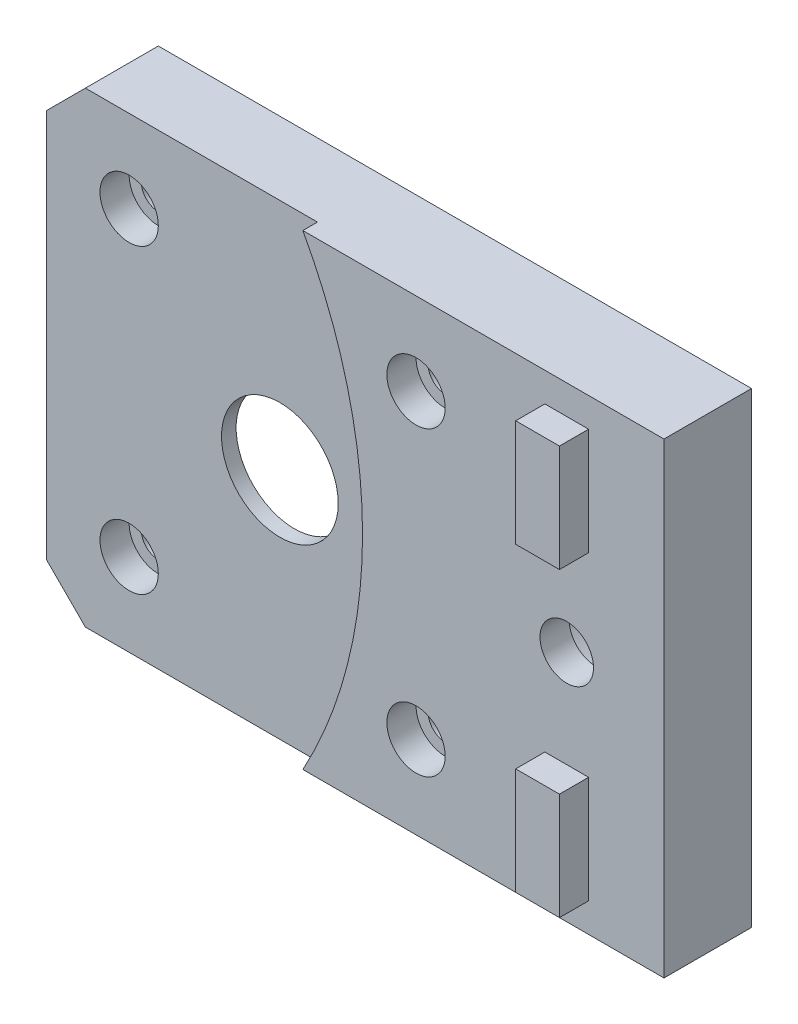
ISO-10303-21;
HEADER;
FILE_DESCRIPTION(('STEP AP214'),'2;1');
FILE_NAME('part.step','',(''),(''),'','','');
FILE_SCHEMA(('AUTOMOTIVE_DESIGN { 1 0 10303 214 1 1 1 1 }'));
ENDSEC;
DATA;
#1=APPLICATION_CONTEXT('core data for automotive mechanical design processes');
#2=APPLICATION_PROTOCOL_DEFINITION('international standard','automotive_design',2000,#1);
#3=PRODUCT_CONTEXT('',#1,'mechanical');
#4=PRODUCT('Part','Part','',(#3));
#5=PRODUCT_RELATED_PRODUCT_CATEGORY('part','',(#4));
#6=PRODUCT_DEFINITION_FORMATION('','',#4);
#7=PRODUCT_DEFINITION_CONTEXT('part definition',#1,'design');
#8=PRODUCT_DEFINITION('design','',#6,#7);
#9=PRODUCT_DEFINITION_SHAPE('','',#8);
#10=(LENGTH_UNIT() NAMED_UNIT(*) SI_UNIT(.MILLI.,.METRE.));
#11=(NAMED_UNIT(*) PLANE_ANGLE_UNIT() SI_UNIT($,.RADIAN.));
#12=(NAMED_UNIT(*) SI_UNIT($,.STERADIAN.) SOLID_ANGLE_UNIT());
#13=UNCERTAINTY_MEASURE_WITH_UNIT(LENGTH_MEASURE(1.E-05),#10,'distance_accuracy_value','');
#14=(GEOMETRIC_REPRESENTATION_CONTEXT(3) GLOBAL_UNCERTAINTY_ASSIGNED_CONTEXT((#13)) GLOBAL_UNIT_ASSIGNED_CONTEXT((#10,
#11,#12)) REPRESENTATION_CONTEXT('',''));
#15=CARTESIAN_POINT('',(0.,0.,0.));
#16=DIRECTION('',(0.,0.,1.));
#17=DIRECTION('',(1.,0.,0.));
#18=AXIS2_PLACEMENT_3D('',#15,#16,#17);
#19=CARTESIAN_POINT('',(31.,0.,9.));
#20=DIRECTION('',(0.,0.,-1.));
#21=DIRECTION('',(-1.,0.,0.));
#22=AXIS2_PLACEMENT_3D('',#19,#20,#21);
#23=CYLINDRICAL_SURFACE('',#22,2.75);
#24=CARTESIAN_POINT('',(31.,0.,6.));
#25=DIRECTION('',(0.,0.,1.));
#26=DIRECTION('',(1.,0.,0.));
#27=AXIS2_PLACEMENT_3D('',#24,#25,#26);
#28=CIRCLE('',#27,2.75);
#29=CARTESIAN_POINT('',(33.75,0.,6.));
#30=VERTEX_POINT('',#29);
#31=EDGE_CURVE('E287',#30,#30,#28,.T.);
#32=ORIENTED_EDGE('',*,*,#31,.T.);
#33=EDGE_LOOP('',(#32));
#34=FACE_BOUND('',#33,.T.);
#35=CARTESIAN_POINT('',(31.,0.,3.));
#36=DIRECTION('',(0.,0.,-1.));
#37=DIRECTION('',(-1.,0.,0.));
#38=AXIS2_PLACEMENT_3D('',#35,#36,#37);
#39=CIRCLE('',#38,2.75);
#40=CARTESIAN_POINT('',(28.25,0.,3.));
#41=VERTEX_POINT('',#40);
#42=EDGE_CURVE('E44',#41,#41,#39,.F.);
#43=ORIENTED_EDGE('',*,*,#42,.F.);
#44=EDGE_LOOP('',(#43));
#45=FACE_BOUND('',#44,.T.);
#46=ADVANCED_FACE('F40',(#34,#45),#23,.F.);
#47=CARTESIAN_POINT('',(-15.4997806436091,15.4997806436091,6.));
#48=DIRECTION('',(0.,0.,-1.));
#49=DIRECTION('',(-1.,0.,0.));
#50=AXIS2_PLACEMENT_3D('',#47,#48,#49);
#51=CYLINDRICAL_SURFACE('',#50,1.75);
#52=CARTESIAN_POINT('',(-15.4997806436091,15.4997806436091,0.));
#53=DIRECTION('',(0.,0.,1.));
#54=DIRECTION('',(1.,0.,0.));
#55=AXIS2_PLACEMENT_3D('',#52,#53,#54);
#56=CIRCLE('',#55,1.75);
#57=CARTESIAN_POINT('',(-13.7497806436091,15.4997806436091,0.));
#58=VERTEX_POINT('',#57);
#59=EDGE_CURVE('E388',#58,#58,#56,.F.);
#60=ORIENTED_EDGE('',*,*,#59,.T.);
#61=EDGE_LOOP('',(#60));
#62=FACE_BOUND('',#61,.T.);
#63=CARTESIAN_POINT('',(-15.4997806436091,15.4997806436091,1.5));
#64=DIRECTION('',(0.,0.,1.));
#65=DIRECTION('',(1.,0.,0.));
#66=AXIS2_PLACEMENT_3D('',#63,#64,#65);
#67=CIRCLE('',#66,1.75);
#68=CARTESIAN_POINT('',(-13.7497806436091,15.4997806436091,1.5));
#69=VERTEX_POINT('',#68);
#70=EDGE_CURVE('E204',#69,#69,#67,.T.);
#71=ORIENTED_EDGE('',*,*,#70,.T.);
#72=EDGE_LOOP('',(#71));
#73=FACE_BOUND('',#72,.T.);
#74=ADVANCED_FACE('F441',(#62,#73),#51,.F.);
#75=CARTESIAN_POINT('',(-15.4997806436091,-15.4997806436091,6.));
#76=DIRECTION('',(0.,0.,-1.));
#77=DIRECTION('',(-1.,0.,0.));
#78=AXIS2_PLACEMENT_3D('',#75,#76,#77);
#79=CYLINDRICAL_SURFACE('',#78,1.75);
#80=CARTESIAN_POINT('',(-15.4997806436091,-15.4997806436091,0.));
#81=DIRECTION('',(0.,0.,1.));
#82=DIRECTION('',(1.,0.,0.));
#83=AXIS2_PLACEMENT_3D('',#80,#81,#82);
#84=CIRCLE('',#83,1.75);
#85=CARTESIAN_POINT('',(-13.7497806436091,-15.4997806436091,0.));
#86=VERTEX_POINT('',#85);
#87=EDGE_CURVE('E392',#86,#86,#84,.F.);
#88=ORIENTED_EDGE('',*,*,#87,.T.);
#89=EDGE_LOOP('',(#88));
#90=FACE_BOUND('',#89,.T.);
#91=CARTESIAN_POINT('',(-15.4997806436091,-15.4997806436091,1.5));
#92=DIRECTION('',(0.,0.,1.));
#93=DIRECTION('',(1.,0.,0.));
#94=AXIS2_PLACEMENT_3D('',#91,#92,#93);
#95=CIRCLE('',#94,1.75);
#96=CARTESIAN_POINT('',(-13.7497806436091,-15.4997806436091,1.5));
#97=VERTEX_POINT('',#96);
#98=EDGE_CURVE('E433',#97,#97,#95,.T.);
#99=ORIENTED_EDGE('',*,*,#98,.T.);
#100=EDGE_LOOP('',(#99));
#101=FACE_BOUND('',#100,.T.);
#102=ADVANCED_FACE('F568',(#90,#101),#79,.F.);
#103=CARTESIAN_POINT('',(0.,0.,6.));
#104=DIRECTION('',(0.,0.,-1.));
#105=DIRECTION('',(-1.,0.,0.));
#106=AXIS2_PLACEMENT_3D('',#103,#104,#105);
#107=CYLINDRICAL_SURFACE('',#106,6.);
#108=CARTESIAN_POINT('',(0.,0.,3.));
#109=DIRECTION('',(0.,0.,1.));
#110=DIRECTION('',(1.,0.,0.));
#111=AXIS2_PLACEMENT_3D('',#108,#109,#110);
#112=CIRCLE('',#111,6.);
#113=CARTESIAN_POINT('',(6.,0.,3.));
#114=VERTEX_POINT('',#113);
#115=EDGE_CURVE('E344',#114,#114,#112,.F.);
#116=ORIENTED_EDGE('',*,*,#115,.T.);
#117=EDGE_LOOP('',(#116));
#118=FACE_BOUND('',#117,.T.);
#119=CARTESIAN_POINT('',(0.,0.,4.5));
#120=DIRECTION('',(0.,0.,1.));
#121=DIRECTION('',(1.,0.,0.));
#122=AXIS2_PLACEMENT_3D('',#119,#120,#121);
#123=CIRCLE('',#122,6.);
#124=CARTESIAN_POINT('',(6.,0.,4.5));
#125=VERTEX_POINT('',#124);
#126=EDGE_CURVE('E214',#125,#125,#123,.T.);
#127=ORIENTED_EDGE('',*,*,#126,.T.);
#128=EDGE_LOOP('',(#127));
#129=FACE_BOUND('',#128,.T.);
#130=ADVANCED_FACE('F618',(#118,#129),#107,.F.);
#131=CARTESIAN_POINT('',(-15.4997806436091,-15.4997806436091,3.));
#132=DIRECTION('',(0.,0.,1.));
#133=DIRECTION('',(1.,0.,0.));
#134=AXIS2_PLACEMENT_3D('',#131,#132,#133);
#135=CYLINDRICAL_SURFACE('',#134,3.);
#136=CARTESIAN_POINT('',(-15.4997806436091,-15.4997806436091,4.5));
#137=DIRECTION('',(0.,0.,1.));
#138=DIRECTION('',(1.,0.,0.));
#139=AXIS2_PLACEMENT_3D('',#136,#137,#138);
#140=CIRCLE('',#139,3.);
#141=CARTESIAN_POINT('',(-12.4997806436091,-15.4997806436091,4.5));
#142=VERTEX_POINT('',#141);
#143=EDGE_CURVE('E478',#142,#142,#140,.F.);
#144=ORIENTED_EDGE('',*,*,#143,.F.);
#145=EDGE_LOOP('',(#144));
#146=FACE_BOUND('',#145,.T.);
#147=CARTESIAN_POINT('',(-15.4997806436091,-15.4997806436091,1.5));
#148=DIRECTION('',(0.,0.,1.));
#149=DIRECTION('',(1.,0.,0.));
#150=AXIS2_PLACEMENT_3D('',#147,#148,#149);
#151=CIRCLE('',#150,3.);
#152=CARTESIAN_POINT('',(-12.4997806436091,-15.4997806436091,1.5));
#153=VERTEX_POINT('',#152);
#154=EDGE_CURVE('E452',#153,#153,#151,.T.);
#155=ORIENTED_EDGE('',*,*,#154,.F.);
#156=EDGE_LOOP('',(#155));
#157=FACE_BOUND('',#156,.T.);
#158=ADVANCED_FACE('F596',(#146,#157),#135,.F.);
#159=CARTESIAN_POINT('',(-15.4997806436091,15.4997806436091,3.));
#160=DIRECTION('',(0.,0.,1.));
#161=DIRECTION('',(1.,0.,0.));
#162=AXIS2_PLACEMENT_3D('',#159,#160,#161);
#163=CYLINDRICAL_SURFACE('',#162,3.);
#164=CARTESIAN_POINT('',(-15.4997806436091,15.4997806436091,4.5));
#165=DIRECTION('',(0.,0.,1.));
#166=DIRECTION('',(1.,0.,0.));
#167=AXIS2_PLACEMENT_3D('',#164,#165,#166);
#168=CIRCLE('',#167,3.);
#169=CARTESIAN_POINT('',(-12.4997806436091,15.4997806436091,4.5));
#170=VERTEX_POINT('',#169);
#171=EDGE_CURVE('E474',#170,#170,#168,.F.);
#172=ORIENTED_EDGE('',*,*,#171,.F.);
#173=EDGE_LOOP('',(#172));
#174=FACE_BOUND('',#173,.T.);
#175=CARTESIAN_POINT('',(-15.4997806436091,15.4997806436091,1.5));
#176=DIRECTION('',(0.,0.,1.));
#177=DIRECTION('',(1.,0.,0.));
#178=AXIS2_PLACEMENT_3D('',#175,#176,#177);
#179=CIRCLE('',#178,3.);
#180=CARTESIAN_POINT('',(-12.4997806436091,15.4997806436091,1.5));
#181=VERTEX_POINT('',#180);
#182=EDGE_CURVE('E436',#181,#181,#179,.T.);
#183=ORIENTED_EDGE('',*,*,#182,.F.);
#184=EDGE_LOOP('',(#183));
#185=FACE_BOUND('',#184,.T.);
#186=ADVANCED_FACE('F592',(#174,#185),#163,.F.);
#187=CARTESIAN_POINT('',(-24.,0.,6.));
#188=DIRECTION('',(-1.,0.,0.));
#189=DIRECTION('',(0.,0.,1.));
#190=AXIS2_PLACEMENT_3D('',#187,#188,#189);
#191=PLANE('',#190);
#192=DIRECTION('',(0.,0.,1.));
#193=VECTOR('',#192,1.);
#194=CARTESIAN_POINT('',(-24.,-20.,6.));
#195=LINE('',#194,#193);
#196=CARTESIAN_POINT('',(-24.,-20.,-3.));
#197=VERTEX_POINT('',#196);
#198=CARTESIAN_POINT('',(-24.,-20.,4.5));
#199=VERTEX_POINT('',#198);
#200=EDGE_CURVE('E424',#197,#199,#195,.T.);
#201=ORIENTED_EDGE('',*,*,#200,.T.);
#202=DIRECTION('',(0.,1.,0.));
#203=VECTOR('',#202,1.);
#204=CARTESIAN_POINT('',(-24.,0.,4.5));
#205=LINE('',#204,#203);
#206=CARTESIAN_POINT('',(-24.,20.,4.5));
#207=VERTEX_POINT('',#206);
#208=EDGE_CURVE('E461',#199,#207,#205,.T.);
#209=ORIENTED_EDGE('',*,*,#208,.T.);
#210=DIRECTION('',(0.,0.,-1.));
#211=VECTOR('',#210,1.);
#212=CARTESIAN_POINT('',(-24.,20.,6.));
#213=LINE('',#212,#211);
#214=CARTESIAN_POINT('',(-24.,20.,-3.));
#215=VERTEX_POINT('',#214);
#216=EDGE_CURVE('E66',#207,#215,#213,.T.);
#217=ORIENTED_EDGE('',*,*,#216,.T.);
#218=DIRECTION('',(0.,1.,0.));
#219=VECTOR('',#218,1.);
#220=CARTESIAN_POINT('',(-24.,0.,-3.));
#221=LINE('',#220,#219);
#222=EDGE_CURVE('E494',#197,#215,#221,.T.);
#223=ORIENTED_EDGE('',*,*,#222,.F.);
#224=EDGE_LOOP('',(#201,#209,#217,#223));
#225=FACE_BOUND('',#224,.T.);
#226=ADVANCED_FACE('F595',(#225),#191,.T.);
#227=CARTESIAN_POINT('',(-20.,-24.,6.));
#228=DIRECTION('',(-0.707106781186549,-0.707106781186546,0.));
#229=DIRECTION('',(0.,0.,1.));
#230=AXIS2_PLACEMENT_3D('',#227,#228,#229);
#231=PLANE('',#230);
#232=DIRECTION('',(0.,0.,-1.));
#233=VECTOR('',#232,1.);
#234=CARTESIAN_POINT('',(-20.,-24.,-3.));
#235=LINE('',#234,#233);
#236=CARTESIAN_POINT('',(-20.,-24.,4.5));
#237=VERTEX_POINT('',#236);
#238=CARTESIAN_POINT('',(-20.,-24.,-3.));
#239=VERTEX_POINT('',#238);
#240=EDGE_CURVE('E413',#237,#239,#235,.T.);
#241=ORIENTED_EDGE('',*,*,#240,.F.);
#242=DIRECTION('',(-0.707106781186546,0.707106781186549,0.));
#243=VECTOR('',#242,1.);
#244=CARTESIAN_POINT('',(-20.,-24.,4.5));
#245=LINE('',#244,#243);
#246=EDGE_CURVE('E467',#237,#199,#245,.T.);
#247=ORIENTED_EDGE('',*,*,#246,.T.);
#248=ORIENTED_EDGE('',*,*,#200,.F.);
#249=DIRECTION('',(-0.707106781186546,0.707106781186549,0.));
#250=VECTOR('',#249,1.);
#251=CARTESIAN_POINT('',(-22.,-21.9999999999999,-3.));
#252=LINE('',#251,#250);
#253=EDGE_CURVE('E419',#239,#197,#252,.T.);
#254=ORIENTED_EDGE('',*,*,#253,.F.);
#255=EDGE_LOOP('',(#241,#247,#248,#254));
#256=FACE_BOUND('',#255,.T.);
#257=ADVANCED_FACE('F656',(#256),#231,.T.);
#258=CARTESIAN_POINT('',(-24.,20.,6.));
#259=DIRECTION('',(0.707106781186546,-0.707106781186549,0.));
#260=DIRECTION('',(0.,0.,-1.));
#261=AXIS2_PLACEMENT_3D('',#258,#259,#260);
#262=PLANE('',#261);
#263=ORIENTED_EDGE('',*,*,#216,.F.);
#264=DIRECTION('',(-0.707106781186549,-0.707106781186546,0.));
#265=VECTOR('',#264,1.);
#266=CARTESIAN_POINT('',(-24.,20.,4.5));
#267=LINE('',#266,#265);
#268=CARTESIAN_POINT('',(-20.,24.,4.5));
#269=VERTEX_POINT('',#268);
#270=EDGE_CURVE('E50',#207,#269,#267,.F.);
#271=ORIENTED_EDGE('',*,*,#270,.T.);
#272=DIRECTION('',(0.,0.,1.));
#273=VECTOR('',#272,1.);
#274=CARTESIAN_POINT('',(-20.,24.,6.));
#275=LINE('',#274,#273);
#276=CARTESIAN_POINT('',(-20.,24.,-3.));
#277=VERTEX_POINT('',#276);
#278=EDGE_CURVE('E428',#277,#269,#275,.T.);
#279=ORIENTED_EDGE('',*,*,#278,.F.);
#280=DIRECTION('',(-0.707106781186549,-0.707106781186546,0.));
#281=VECTOR('',#280,1.);
#282=CARTESIAN_POINT('',(-22.,22.,-3.));
#283=LINE('',#282,#281);
#284=EDGE_CURVE('E416',#215,#277,#283,.F.);
#285=ORIENTED_EDGE('',*,*,#284,.F.);
#286=EDGE_LOOP('',(#263,#271,#279,#285));
#287=FACE_BOUND('',#286,.T.);
#288=ADVANCED_FACE('F42',(#287),#262,.F.);
#289=CARTESIAN_POINT('',(0.,21.,6.));
#290=DIRECTION('',(0.,1.,0.));
#291=DIRECTION('',(0.,0.,1.));
#292=AXIS2_PLACEMENT_3D('',#289,#290,#291);
#293=PLANE('',#292);
#294=DIRECTION('',(0.,0.,-1.));
#295=VECTOR('',#294,1.);
#296=CARTESIAN_POINT('',(33.25,21.,9.));
#297=LINE('',#296,#295);
#298=CARTESIAN_POINT('',(33.25,21.,9.));
#299=VERTEX_POINT('',#298);
#300=CARTESIAN_POINT('',(33.25,21.,6.));
#301=VERTEX_POINT('',#300);
#302=EDGE_CURVE('E321',#299,#301,#297,.T.);
#303=ORIENTED_EDGE('',*,*,#302,.T.);
#304=DIRECTION('',(-1.,0.,0.));
#305=VECTOR('',#304,1.);
#306=CARTESIAN_POINT('',(0.,21.,6.));
#307=LINE('',#306,#305);
#308=CARTESIAN_POINT('',(28.75,21.,6.));
#309=VERTEX_POINT('',#308);
#310=EDGE_CURVE('E261',#301,#309,#307,.T.);
#311=ORIENTED_EDGE('',*,*,#310,.T.);
#312=DIRECTION('',(0.,0.,-1.));
#313=VECTOR('',#312,1.);
#314=CARTESIAN_POINT('',(28.75,21.,9.));
#315=LINE('',#314,#313);
#316=CARTESIAN_POINT('',(28.75,21.,9.));
#317=VERTEX_POINT('',#316);
#318=EDGE_CURVE('E308',#317,#309,#315,.T.);
#319=ORIENTED_EDGE('',*,*,#318,.F.);
#320=DIRECTION('',(-1.,0.,0.));
#321=VECTOR('',#320,1.);
#322=CARTESIAN_POINT('',(33.25,21.,9.));
#323=LINE('',#322,#321);
#324=EDGE_CURVE('E305',#299,#317,#323,.T.);
#325=ORIENTED_EDGE('',*,*,#324,.F.);
#326=EDGE_LOOP('',(#303,#311,#319,#325));
#327=FACE_BOUND('',#326,.T.);
#328=ADVANCED_FACE('F649',(#327),#293,.T.);
#329=CARTESIAN_POINT('',(0.,-21.,6.));
#330=DIRECTION('',(0.,1.,0.));
#331=DIRECTION('',(0.,0.,1.));
#332=AXIS2_PLACEMENT_3D('',#329,#330,#331);
#333=PLANE('',#332);
#334=DIRECTION('',(-1.,0.,0.));
#335=VECTOR('',#334,1.);
#336=CARTESIAN_POINT('',(0.,-21.,6.));
#337=LINE('',#336,#335);
#338=CARTESIAN_POINT('',(33.25,-21.,6.));
#339=VERTEX_POINT('',#338);
#340=CARTESIAN_POINT('',(28.75,-21.,6.));
#341=VERTEX_POINT('',#340);
#342=EDGE_CURVE('E237',#339,#341,#337,.T.);
#343=ORIENTED_EDGE('',*,*,#342,.F.);
#344=DIRECTION('',(0.,0.,-1.));
#345=VECTOR('',#344,1.);
#346=CARTESIAN_POINT('',(33.25,-21.,9.));
#347=LINE('',#346,#345);
#348=CARTESIAN_POINT('',(33.25,-21.,9.));
#349=VERTEX_POINT('',#348);
#350=EDGE_CURVE('E325',#349,#339,#347,.T.);
#351=ORIENTED_EDGE('',*,*,#350,.F.);
#352=DIRECTION('',(1.,0.,0.));
#353=VECTOR('',#352,1.);
#354=CARTESIAN_POINT('',(33.25,-21.,9.));
#355=LINE('',#354,#353);
#356=CARTESIAN_POINT('',(28.75,-21.,9.));
#357=VERTEX_POINT('',#356);
#358=EDGE_CURVE('E296',#357,#349,#355,.T.);
#359=ORIENTED_EDGE('',*,*,#358,.F.);
#360=DIRECTION('',(0.,0.,-1.));
#361=VECTOR('',#360,1.);
#362=CARTESIAN_POINT('',(28.75,-21.,9.));
#363=LINE('',#362,#361);
#364=EDGE_CURVE('E329',#357,#341,#363,.T.);
#365=ORIENTED_EDGE('',*,*,#364,.T.);
#366=EDGE_LOOP('',(#343,#351,#359,#365));
#367=FACE_BOUND('',#366,.T.);
#368=ADVANCED_FACE('F590',(#367),#333,.F.);
#369=CARTESIAN_POINT('',(28.75,-21.,9.));
#370=DIRECTION('',(1.,0.,0.));
#371=DIRECTION('',(0.,0.,-1.));
#372=AXIS2_PLACEMENT_3D('',#369,#370,#371);
#373=PLANE('',#372);
#374=DIRECTION('',(0.,0.,1.));
#375=VECTOR('',#374,1.);
#376=CARTESIAN_POINT('',(28.75,-10.,9.));
#377=LINE('',#376,#375);
#378=CARTESIAN_POINT('',(28.75,-10.,6.));
#379=VERTEX_POINT('',#378);
#380=CARTESIAN_POINT('',(28.75,-10.,9.));
#381=VERTEX_POINT('',#380);
#382=EDGE_CURVE('E281',#379,#381,#377,.T.);
#383=ORIENTED_EDGE('',*,*,#382,.F.);
#384=DIRECTION('',(0.,-1.,0.));
#385=VECTOR('',#384,1.);
#386=CARTESIAN_POINT('',(28.75,-21.,6.));
#387=LINE('',#386,#385);
#388=EDGE_CURVE('E291',#379,#341,#387,.T.);
#389=ORIENTED_EDGE('',*,*,#388,.T.);
#390=ORIENTED_EDGE('',*,*,#364,.F.);
#391=DIRECTION('',(0.,-1.,0.));
#392=VECTOR('',#391,1.);
#393=CARTESIAN_POINT('',(28.75,-21.,9.));
#394=LINE('',#393,#392);
#395=EDGE_CURVE('E297',#381,#357,#394,.T.);
#396=ORIENTED_EDGE('',*,*,#395,.F.);
#397=EDGE_LOOP('',(#383,#389,#390,#396));
#398=FACE_BOUND('',#397,.T.);
#399=ADVANCED_FACE('F585',(#398),#373,.F.);
#400=CARTESIAN_POINT('',(33.25,-21.,9.));
#401=DIRECTION('',(-1.,0.,0.));
#402=DIRECTION('',(0.,0.,1.));
#403=AXIS2_PLACEMENT_3D('',#400,#401,#402);
#404=PLANE('',#403);
#405=DIRECTION('',(0.,0.,1.));
#406=VECTOR('',#405,1.);
#407=CARTESIAN_POINT('',(33.25,9.99999999999999,9.));
#408=LINE('',#407,#406);
#409=CARTESIAN_POINT('',(33.25,10.,6.));
#410=VERTEX_POINT('',#409);
#411=CARTESIAN_POINT('',(33.25,10.,9.));
#412=VERTEX_POINT('',#411);
#413=EDGE_CURVE('E284',#410,#412,#408,.T.);
#414=ORIENTED_EDGE('',*,*,#413,.F.);
#415=DIRECTION('',(0.,1.,0.));
#416=VECTOR('',#415,1.);
#417=CARTESIAN_POINT('',(33.25,-21.,6.));
#418=LINE('',#417,#416);
#419=EDGE_CURVE('E313',#410,#301,#418,.T.);
#420=ORIENTED_EDGE('',*,*,#419,.T.);
#421=ORIENTED_EDGE('',*,*,#302,.F.);
#422=DIRECTION('',(0.,1.,0.));
#423=VECTOR('',#422,1.);
#424=CARTESIAN_POINT('',(33.25,-21.,9.));
#425=LINE('',#424,#423);
#426=EDGE_CURVE('E300',#412,#299,#425,.T.);
#427=ORIENTED_EDGE('',*,*,#426,.F.);
#428=EDGE_LOOP('',(#414,#420,#421,#427));
#429=FACE_BOUND('',#428,.T.);
#430=ADVANCED_FACE('F580',(#429),#404,.F.);
#431=CARTESIAN_POINT('',(0.,0.,9.));
#432=DIRECTION('',(0.,0.,1.));
#433=DIRECTION('',(1.,0.,0.));
#434=AXIS2_PLACEMENT_3D('',#431,#432,#433);
#435=PLANE('',#434);
#436=CARTESIAN_POINT('',(28.75,9.99999999999999,9.));
#437=VERTEX_POINT('',#436);
#438=EDGE_CURVE('E292',#317,#437,#394,.T.);
#439=ORIENTED_EDGE('',*,*,#438,.T.);
#440=DIRECTION('',(-1.,0.,0.));
#441=VECTOR('',#440,1.);
#442=CARTESIAN_POINT('',(35.7282177914324,10.,9.));
#443=LINE('',#442,#441);
#444=EDGE_CURVE('E268',#412,#437,#443,.T.);
#445=ORIENTED_EDGE('',*,*,#444,.F.);
#446=ORIENTED_EDGE('',*,*,#426,.T.);
#447=ORIENTED_EDGE('',*,*,#324,.T.);
#448=EDGE_LOOP('',(#439,#445,#446,#447));
#449=FACE_BOUND('',#448,.T.);
#450=ADVANCED_FACE('F576',(#449),#435,.T.);
#451=DIRECTION('',(0.,0.,-1.));
#452=VECTOR('',#451,1.);
#453=CARTESIAN_POINT('',(28.75,9.99999999999999,9.));
#454=LINE('',#453,#452);
#455=CARTESIAN_POINT('',(28.75,9.99999999999999,6.));
#456=VERTEX_POINT('',#455);
#457=EDGE_CURVE('E406',#437,#456,#454,.T.);
#458=ORIENTED_EDGE('',*,*,#457,.F.);
#459=ORIENTED_EDGE('',*,*,#438,.F.);
#460=ORIENTED_EDGE('',*,*,#318,.T.);
#461=EDGE_CURVE('E309',#309,#456,#387,.T.);
#462=ORIENTED_EDGE('',*,*,#461,.T.);
#463=EDGE_LOOP('',(#458,#459,#460,#462));
#464=FACE_BOUND('',#463,.T.);
#465=ADVANCED_FACE('F579',(#464),#373,.F.);
#466=DIRECTION('',(0.,0.,-1.));
#467=VECTOR('',#466,1.);
#468=CARTESIAN_POINT('',(33.25,-10.,9.));
#469=LINE('',#468,#467);
#470=CARTESIAN_POINT('',(33.25,-10.,9.));
#471=VERTEX_POINT('',#470);
#472=CARTESIAN_POINT('',(33.25,-10.,6.));
#473=VERTEX_POINT('',#472);
#474=EDGE_CURVE('E272',#471,#473,#469,.T.);
#475=ORIENTED_EDGE('',*,*,#474,.F.);
#476=EDGE_CURVE('E301',#349,#471,#425,.T.);
#477=ORIENTED_EDGE('',*,*,#476,.F.);
#478=ORIENTED_EDGE('',*,*,#350,.T.);
#479=EDGE_CURVE('E314',#339,#473,#418,.T.);
#480=ORIENTED_EDGE('',*,*,#479,.T.);
#481=EDGE_LOOP('',(#475,#477,#478,#480));
#482=FACE_BOUND('',#481,.T.);
#483=ADVANCED_FACE('F587',(#482),#404,.F.);
#484=ORIENTED_EDGE('',*,*,#476,.T.);
#485=DIRECTION('',(1.,0.,0.));
#486=VECTOR('',#485,1.);
#487=CARTESIAN_POINT('',(35.7282177914324,-10.,9.));
#488=LINE('',#487,#486);
#489=EDGE_CURVE('E265',#381,#471,#488,.T.);
#490=ORIENTED_EDGE('',*,*,#489,.F.);
#491=ORIENTED_EDGE('',*,*,#395,.T.);
#492=ORIENTED_EDGE('',*,*,#358,.T.);
#493=EDGE_LOOP('',(#484,#490,#491,#492));
#494=FACE_BOUND('',#493,.T.);
#495=ADVANCED_FACE('F582',(#494),#435,.T.);
#496=CARTESIAN_POINT('',(15.4997806436091,15.4997806436091,6.));
#497=DIRECTION('',(0.,0.,-1.));
#498=DIRECTION('',(-1.,0.,0.));
#499=AXIS2_PLACEMENT_3D('',#496,#497,#498);
#500=CYLINDRICAL_SURFACE('',#499,1.75);
#501=CARTESIAN_POINT('',(15.4997806436091,15.4997806436091,0.));
#502=DIRECTION('',(0.,0.,1.));
#503=DIRECTION('',(1.,0.,0.));
#504=AXIS2_PLACEMENT_3D('',#501,#502,#503);
#505=CIRCLE('',#504,1.75);
#506=CARTESIAN_POINT('',(17.2497806436091,15.4997806436091,0.));
#507=VERTEX_POINT('',#506);
#508=EDGE_CURVE('E384',#507,#507,#505,.F.);
#509=ORIENTED_EDGE('',*,*,#508,.T.);
#510=EDGE_LOOP('',(#509));
#511=FACE_BOUND('',#510,.T.);
#512=CARTESIAN_POINT('',(15.4997806436091,15.4997806436091,3.));
#513=DIRECTION('',(0.,0.,1.));
#514=DIRECTION('',(1.,0.,0.));
#515=AXIS2_PLACEMENT_3D('',#512,#513,#514);
#516=CIRCLE('',#515,1.75);
#517=CARTESIAN_POINT('',(17.2497806436091,15.4997806436091,3.));
#518=VERTEX_POINT('',#517);
#519=EDGE_CURVE('E334',#518,#518,#516,.T.);
#520=ORIENTED_EDGE('',*,*,#519,.T.);
#521=EDGE_LOOP('',(#520));
#522=FACE_BOUND('',#521,.T.);
#523=ADVANCED_FACE('F630',(#511,#522),#500,.F.);
#524=CARTESIAN_POINT('',(15.4997806436091,-15.4997806436091,6.));
#525=DIRECTION('',(0.,0.,-1.));
#526=DIRECTION('',(-1.,0.,0.));
#527=AXIS2_PLACEMENT_3D('',#524,#525,#526);
#528=CYLINDRICAL_SURFACE('',#527,1.75);
#529=CARTESIAN_POINT('',(15.4997806436091,-15.4997806436091,0.));
#530=DIRECTION('',(0.,0.,1.));
#531=DIRECTION('',(1.,0.,0.));
#532=AXIS2_PLACEMENT_3D('',#529,#530,#531);
#533=CIRCLE('',#532,1.75);
#534=CARTESIAN_POINT('',(17.2497806436091,-15.4997806436091,0.));
#535=VERTEX_POINT('',#534);
#536=EDGE_CURVE('E367',#535,#535,#533,.F.);
#537=ORIENTED_EDGE('',*,*,#536,.T.);
#538=EDGE_LOOP('',(#537));
#539=FACE_BOUND('',#538,.T.);
#540=CARTESIAN_POINT('',(15.4997806436091,-15.4997806436091,3.));
#541=DIRECTION('',(0.,0.,1.));
#542=DIRECTION('',(1.,0.,0.));
#543=AXIS2_PLACEMENT_3D('',#540,#541,#542);
#544=CIRCLE('',#543,1.75);
#545=CARTESIAN_POINT('',(17.2497806436091,-15.4997806436091,3.));
#546=VERTEX_POINT('',#545);
#547=EDGE_CURVE('E333',#546,#546,#544,.T.);
#548=ORIENTED_EDGE('',*,*,#547,.T.);
#549=EDGE_LOOP('',(#548));
#550=FACE_BOUND('',#549,.T.);
#551=ADVANCED_FACE('F626',(#539,#550),#528,.F.);
#552=CARTESIAN_POINT('',(41.,0.,6.));
#553=DIRECTION('',(1.,0.,0.));
#554=DIRECTION('',(0.,1.,0.));
#555=AXIS2_PLACEMENT_3D('',#552,#553,#554);
#556=PLANE('',#555);
#557=DIRECTION('',(0.,-1.,0.));
#558=VECTOR('',#557,1.);
#559=CARTESIAN_POINT('',(41.,0.,6.));
#560=LINE('',#559,#558);
#561=CARTESIAN_POINT('',(41.,24.,6.));
#562=VERTEX_POINT('',#561);
#563=CARTESIAN_POINT('',(41.,-24.,6.));
#564=VERTEX_POINT('',#563);
#565=EDGE_CURVE('E219',#562,#564,#560,.T.);
#566=ORIENTED_EDGE('',*,*,#565,.T.);
#567=DIRECTION('',(0.,0.,-1.));
#568=VECTOR('',#567,1.);
#569=CARTESIAN_POINT('',(41.,-24.,6.));
#570=LINE('',#569,#568);
#571=CARTESIAN_POINT('',(41.,-24.,-3.));
#572=VERTEX_POINT('',#571);
#573=EDGE_CURVE('E253',#564,#572,#570,.T.);
#574=ORIENTED_EDGE('',*,*,#573,.T.);
#575=DIRECTION('',(0.,1.,0.));
#576=VECTOR('',#575,1.);
#577=CARTESIAN_POINT('',(41.,0.,-3.));
#578=LINE('',#577,#576);
#579=CARTESIAN_POINT('',(41.,24.,-3.));
#580=VERTEX_POINT('',#579);
#581=EDGE_CURVE('E487',#572,#580,#578,.T.);
#582=ORIENTED_EDGE('',*,*,#581,.T.);
#583=DIRECTION('',(0.,0.,-1.));
#584=VECTOR('',#583,1.);
#585=CARTESIAN_POINT('',(41.,24.,6.));
#586=LINE('',#585,#584);
#587=EDGE_CURVE('E227',#562,#580,#586,.T.);
#588=ORIENTED_EDGE('',*,*,#587,.F.);
#589=EDGE_LOOP('',(#566,#574,#582,#588));
#590=FACE_BOUND('',#589,.T.);
#591=ADVANCED_FACE('F629',(#590),#556,.T.);
#592=CARTESIAN_POINT('',(0.,0.,6.));
#593=DIRECTION('',(0.,0.,1.));
#594=DIRECTION('',(1.,0.,0.));
#595=AXIS2_PLACEMENT_3D('',#592,#593,#594);
#596=PLANE('',#595);
#597=CARTESIAN_POINT('',(-40.,0.,6.));
#598=DIRECTION('',(0.,0.,1.));
#599=DIRECTION('',(1.,0.,0.));
#600=AXIS2_PLACEMENT_3D('',#597,#598,#599);
#601=CIRCLE('',#600,50.);
#602=CARTESIAN_POINT('',(3.86342439892263,-24.,6.));
#603=VERTEX_POINT('',#602);
#604=CARTESIAN_POINT('',(3.86342439892263,24.,6.));
#605=VERTEX_POINT('',#604);
#606=EDGE_CURVE('E194',#603,#605,#601,.T.);
#607=ORIENTED_EDGE('',*,*,#606,.F.);
#608=DIRECTION('',(1.,0.,0.));
#609=VECTOR('',#608,1.);
#610=CARTESIAN_POINT('',(0.,-24.,6.));
#611=LINE('',#610,#609);
#612=EDGE_CURVE('E222',#603,#564,#611,.T.);
#613=ORIENTED_EDGE('',*,*,#612,.T.);
#614=ORIENTED_EDGE('',*,*,#565,.F.);
#615=DIRECTION('',(1.,0.,0.));
#616=VECTOR('',#615,1.);
#617=CARTESIAN_POINT('',(0.,24.,6.));
#618=LINE('',#617,#616);
#619=EDGE_CURVE('E209',#605,#562,#618,.T.);
#620=ORIENTED_EDGE('',*,*,#619,.F.);
#621=EDGE_LOOP('',(#607,#613,#614,#620));
#622=FACE_BOUND('',#621,.T.);
#623=ORIENTED_EDGE('',*,*,#310,.F.);
#624=ORIENTED_EDGE('',*,*,#419,.F.);
#625=DIRECTION('',(-1.,0.,0.));
#626=VECTOR('',#625,1.);
#627=CARTESIAN_POINT('',(35.7282177914324,10.,6.));
#628=LINE('',#627,#626);
#629=EDGE_CURVE('E269',#410,#456,#628,.T.);
#630=ORIENTED_EDGE('',*,*,#629,.T.);
#631=ORIENTED_EDGE('',*,*,#461,.F.);
#632=EDGE_LOOP('',(#623,#624,#630,#631));
#633=FACE_BOUND('',#632,.T.);
#634=ORIENTED_EDGE('',*,*,#342,.T.);
#635=ORIENTED_EDGE('',*,*,#388,.F.);
#636=DIRECTION('',(1.,0.,0.));
#637=VECTOR('',#636,1.);
#638=CARTESIAN_POINT('',(35.7282177914324,-10.,6.));
#639=LINE('',#638,#637);
#640=EDGE_CURVE('E264',#379,#473,#639,.T.);
#641=ORIENTED_EDGE('',*,*,#640,.T.);
#642=ORIENTED_EDGE('',*,*,#479,.F.);
#643=EDGE_LOOP('',(#634,#635,#641,#642));
#644=FACE_BOUND('',#643,.T.);
#645=CARTESIAN_POINT('',(15.4997806436091,-15.4997806436091,6.));
#646=DIRECTION('',(0.,0.,1.));
#647=DIRECTION('',(1.,0.,0.));
#648=AXIS2_PLACEMENT_3D('',#645,#646,#647);
#649=CIRCLE('',#648,3.);
#650=CARTESIAN_POINT('',(18.4997806436091,-15.4997806436091,6.));
#651=VERTEX_POINT('',#650);
#652=EDGE_CURVE('E351',#651,#651,#649,.T.);
#653=ORIENTED_EDGE('',*,*,#652,.F.);
#654=EDGE_LOOP('',(#653));
#655=FACE_BOUND('',#654,.T.);
#656=CARTESIAN_POINT('',(15.4997806436091,15.4997806436091,6.));
#657=DIRECTION('',(0.,0.,1.));
#658=DIRECTION('',(1.,0.,0.));
#659=AXIS2_PLACEMENT_3D('',#656,#657,#658);
#660=CIRCLE('',#659,3.);
#661=CARTESIAN_POINT('',(18.4997806436091,15.4997806436091,6.));
#662=VERTEX_POINT('',#661);
#663=EDGE_CURVE('E338',#662,#662,#660,.T.);
#664=ORIENTED_EDGE('',*,*,#663,.F.);
#665=EDGE_LOOP('',(#664));
#666=FACE_BOUND('',#665,.T.);
#667=ORIENTED_EDGE('',*,*,#31,.F.);
#668=EDGE_LOOP('',(#667));
#669=FACE_BOUND('',#668,.T.);
#670=ADVANCED_FACE('F216',(#622,#633,#644,#655,#666,#669),#596,.T.);
#671=CARTESIAN_POINT('',(0.,0.,0.));
#672=DIRECTION('',(0.,0.,1.));
#673=DIRECTION('',(1.,0.,0.));
#674=AXIS2_PLACEMENT_3D('',#671,#672,#673);
#675=PLANE('',#674);
#676=ORIENTED_EDGE('',*,*,#536,.F.);
#677=EDGE_LOOP('',(#676));
#678=FACE_BOUND('',#677,.T.);
#679=ORIENTED_EDGE('',*,*,#87,.F.);
#680=EDGE_LOOP('',(#679));
#681=FACE_BOUND('',#680,.T.);
#682=ORIENTED_EDGE('',*,*,#59,.F.);
#683=EDGE_LOOP('',(#682));
#684=FACE_BOUND('',#683,.T.);
#685=ORIENTED_EDGE('',*,*,#508,.F.);
#686=EDGE_LOOP('',(#685));
#687=FACE_BOUND('',#686,.T.);
#688=CARTESIAN_POINT('',(0.,0.,0.));
#689=DIRECTION('',(0.,0.,1.));
#690=DIRECTION('',(1.,0.,0.));
#691=AXIS2_PLACEMENT_3D('',#688,#689,#690);
#692=CIRCLE('',#691,11.25);
#693=CARTESIAN_POINT('',(11.25,0.,0.));
#694=VERTEX_POINT('',#693);
#695=EDGE_CURVE('E363',#694,#694,#692,.T.);
#696=ORIENTED_EDGE('',*,*,#695,.T.);
#697=EDGE_LOOP('',(#696));
#698=FACE_BOUND('',#697,.T.);
#699=DIRECTION('',(1.,0.,0.));
#700=VECTOR('',#699,1.);
#701=CARTESIAN_POINT('',(0.,21.,0.));
#702=LINE('',#701,#700);
#703=CARTESIAN_POINT('',(-18.,21.,0.));
#704=VERTEX_POINT('',#703);
#705=CARTESIAN_POINT('',(21.,21.,0.));
#706=VERTEX_POINT('',#705);
#707=EDGE_CURVE('E362',#704,#706,#702,.T.);
#708=ORIENTED_EDGE('',*,*,#707,.T.);
#709=DIRECTION('',(0.,-1.,0.));
#710=VECTOR('',#709,1.);
#711=CARTESIAN_POINT('',(21.,0.,0.));
#712=LINE('',#711,#710);
#713=CARTESIAN_POINT('',(21.,-21.,0.));
#714=VERTEX_POINT('',#713);
#715=EDGE_CURVE('E409',#706,#714,#712,.T.);
#716=ORIENTED_EDGE('',*,*,#715,.T.);
#717=DIRECTION('',(1.,0.,0.));
#718=VECTOR('',#717,1.);
#719=CARTESIAN_POINT('',(0.,-21.,0.));
#720=LINE('',#719,#718);
#721=CARTESIAN_POINT('',(-18.,-21.,0.));
#722=VERTEX_POINT('',#721);
#723=EDGE_CURVE('E371',#722,#714,#720,.T.);
#724=ORIENTED_EDGE('',*,*,#723,.F.);
#725=DIRECTION('',(-0.707106781186546,0.707106781186549,0.));
#726=VECTOR('',#725,1.);
#727=CARTESIAN_POINT('',(-18.,-21.,0.));
#728=LINE('',#727,#726);
#729=CARTESIAN_POINT('',(-21.,-18.,0.));
#730=VERTEX_POINT('',#729);
#731=EDGE_CURVE('E370',#722,#730,#728,.T.);
#732=ORIENTED_EDGE('',*,*,#731,.T.);
#733=DIRECTION('',(0.,1.,0.));
#734=VECTOR('',#733,1.);
#735=CARTESIAN_POINT('',(-21.,0.,0.));
#736=LINE('',#735,#734);
#737=CARTESIAN_POINT('',(-21.,18.,0.));
#738=VERTEX_POINT('',#737);
#739=EDGE_CURVE('E375',#730,#738,#736,.T.);
#740=ORIENTED_EDGE('',*,*,#739,.T.);
#741=DIRECTION('',(-0.707106781186548,-0.707106781186547,0.));
#742=VECTOR('',#741,1.);
#743=CARTESIAN_POINT('',(-21.,18.,0.));
#744=LINE('',#743,#742);
#745=EDGE_CURVE('E402',#738,#704,#744,.F.);
#746=ORIENTED_EDGE('',*,*,#745,.T.);
#747=EDGE_LOOP('',(#708,#716,#724,#732,#740,#746));
#748=FACE_BOUND('',#747,.T.);
#749=ADVANCED_FACE('F537',(#678,#681,#684,#687,#698,#748),#675,.F.);
#750=CARTESIAN_POINT('',(0.,0.,3.));
#751=DIRECTION('',(0.,0.,-1.));
#752=DIRECTION('',(-1.,0.,0.));
#753=AXIS2_PLACEMENT_3D('',#750,#751,#752);
#754=CYLINDRICAL_SURFACE('',#753,11.25);
#755=CARTESIAN_POINT('',(0.,0.,3.));
#756=DIRECTION('',(0.,0.,1.));
#757=DIRECTION('',(1.,0.,0.));
#758=AXIS2_PLACEMENT_3D('',#755,#756,#757);
#759=CIRCLE('',#758,11.25);
#760=CARTESIAN_POINT('',(11.25,0.,3.));
#761=VERTEX_POINT('',#760);
#762=EDGE_CURVE('E358',#761,#761,#759,.T.);
#763=ORIENTED_EDGE('',*,*,#762,.T.);
#764=EDGE_LOOP('',(#763));
#765=FACE_BOUND('',#764,.T.);
#766=ORIENTED_EDGE('',*,*,#695,.F.);
#767=EDGE_LOOP('',(#766));
#768=FACE_BOUND('',#767,.T.);
#769=ADVANCED_FACE('F637',(#765,#768),#754,.F.);
#770=CARTESIAN_POINT('',(0.,0.,3.));
#771=DIRECTION('',(0.,0.,1.));
#772=DIRECTION('',(1.,0.,0.));
#773=AXIS2_PLACEMENT_3D('',#770,#771,#772);
#774=PLANE('',#773);
#775=ORIENTED_EDGE('',*,*,#115,.F.);
#776=EDGE_LOOP('',(#775));
#777=FACE_BOUND('',#776,.T.);
#778=ORIENTED_EDGE('',*,*,#762,.F.);
#779=EDGE_LOOP('',(#778));
#780=FACE_BOUND('',#779,.T.);
#781=ADVANCED_FACE('F614',(#777,#780),#774,.F.);
#782=CARTESIAN_POINT('',(15.4997806436091,-15.4997806436091,3.));
#783=DIRECTION('',(0.,0.,1.));
#784=DIRECTION('',(1.,0.,0.));
#785=AXIS2_PLACEMENT_3D('',#782,#783,#784);
#786=CYLINDRICAL_SURFACE('',#785,3.);
#787=CARTESIAN_POINT('',(15.4997806436091,-15.4997806436091,3.));
#788=DIRECTION('',(0.,0.,1.));
#789=DIRECTION('',(1.,0.,0.));
#790=AXIS2_PLACEMENT_3D('',#787,#788,#789);
#791=CIRCLE('',#790,3.);
#792=CARTESIAN_POINT('',(18.4997806436091,-15.4997806436091,3.));
#793=VERTEX_POINT('',#792);
#794=EDGE_CURVE('E339',#793,#793,#791,.T.);
#795=ORIENTED_EDGE('',*,*,#794,.F.);
#796=EDGE_LOOP('',(#795));
#797=FACE_BOUND('',#796,.T.);
#798=ORIENTED_EDGE('',*,*,#652,.T.);
#799=EDGE_LOOP('',(#798));
#800=FACE_BOUND('',#799,.T.);
#801=ADVANCED_FACE('F610',(#797,#800),#786,.F.);
#802=CARTESIAN_POINT('',(15.4997806436091,-15.4997806436091,3.));
#803=DIRECTION('',(0.,0.,1.));
#804=DIRECTION('',(1.,0.,0.));
#805=AXIS2_PLACEMENT_3D('',#802,#803,#804);
#806=PLANE('',#805);
#807=ORIENTED_EDGE('',*,*,#547,.F.);
#808=EDGE_LOOP('',(#807));
#809=FACE_BOUND('',#808,.T.);
#810=ORIENTED_EDGE('',*,*,#794,.T.);
#811=EDGE_LOOP('',(#810));
#812=FACE_BOUND('',#811,.T.);
#813=ADVANCED_FACE('F606',(#809,#812),#806,.T.);
#814=CARTESIAN_POINT('',(15.4997806436091,15.4997806436091,3.));
#815=DIRECTION('',(0.,0.,1.));
#816=DIRECTION('',(1.,0.,0.));
#817=AXIS2_PLACEMENT_3D('',#814,#815,#816);
#818=CYLINDRICAL_SURFACE('',#817,3.);
#819=CARTESIAN_POINT('',(15.4997806436091,15.4997806436091,3.));
#820=DIRECTION('',(0.,0.,1.));
#821=DIRECTION('',(1.,0.,0.));
#822=AXIS2_PLACEMENT_3D('',#819,#820,#821);
#823=CIRCLE('',#822,3.);
#824=CARTESIAN_POINT('',(18.4997806436091,15.4997806436091,3.));
#825=VERTEX_POINT('',#824);
#826=EDGE_CURVE('E340',#825,#825,#823,.T.);
#827=ORIENTED_EDGE('',*,*,#826,.F.);
#828=EDGE_LOOP('',(#827));
#829=FACE_BOUND('',#828,.T.);
#830=ORIENTED_EDGE('',*,*,#663,.T.);
#831=EDGE_LOOP('',(#830));
#832=FACE_BOUND('',#831,.T.);
#833=ADVANCED_FACE('F602',(#829,#832),#818,.F.);
#834=CARTESIAN_POINT('',(15.4997806436091,15.4997806436091,3.));
#835=DIRECTION('',(0.,0.,1.));
#836=DIRECTION('',(1.,0.,0.));
#837=AXIS2_PLACEMENT_3D('',#834,#835,#836);
#838=PLANE('',#837);
#839=ORIENTED_EDGE('',*,*,#519,.F.);
#840=EDGE_LOOP('',(#839));
#841=FACE_BOUND('',#840,.T.);
#842=ORIENTED_EDGE('',*,*,#826,.T.);
#843=EDGE_LOOP('',(#842));
#844=FACE_BOUND('',#843,.T.);
#845=ADVANCED_FACE('F598',(#841,#844),#838,.T.);
#846=CARTESIAN_POINT('',(35.7282177914324,10.,9.));
#847=DIRECTION('',(0.,-1.,0.));
#848=DIRECTION('',(1.,0.,0.));
#849=AXIS2_PLACEMENT_3D('',#846,#847,#848);
#850=PLANE('',#849);
#851=ORIENTED_EDGE('',*,*,#413,.T.);
#852=ORIENTED_EDGE('',*,*,#444,.T.);
#853=ORIENTED_EDGE('',*,*,#457,.T.);
#854=ORIENTED_EDGE('',*,*,#629,.F.);
#855=EDGE_LOOP('',(#851,#852,#853,#854));
#856=FACE_BOUND('',#855,.T.);
#857=ADVANCED_FACE('F601',(#856),#850,.T.);
#858=CARTESIAN_POINT('',(35.7282177914324,-10.,9.));
#859=DIRECTION('',(0.,1.,0.));
#860=DIRECTION('',(-1.,0.,0.));
#861=AXIS2_PLACEMENT_3D('',#858,#859,#860);
#862=PLANE('',#861);
#863=ORIENTED_EDGE('',*,*,#382,.T.);
#864=ORIENTED_EDGE('',*,*,#489,.T.);
#865=ORIENTED_EDGE('',*,*,#474,.T.);
#866=ORIENTED_EDGE('',*,*,#640,.F.);
#867=EDGE_LOOP('',(#863,#864,#865,#866));
#868=FACE_BOUND('',#867,.T.);
#869=ADVANCED_FACE('F574',(#868),#862,.T.);
#870=CARTESIAN_POINT('',(21.,0.,6.));
#871=DIRECTION('',(-1.,0.,0.));
#872=DIRECTION('',(0.,0.,1.));
#873=AXIS2_PLACEMENT_3D('',#870,#871,#872);
#874=PLANE('',#873);
#875=ORIENTED_EDGE('',*,*,#715,.F.);
#876=DIRECTION('',(0.,0.,-1.));
#877=VECTOR('',#876,1.);
#878=CARTESIAN_POINT('',(21.,21.,6.));
#879=LINE('',#878,#877);
#880=CARTESIAN_POINT('',(21.,21.,-3.));
#881=VERTEX_POINT('',#880);
#882=EDGE_CURVE('E250',#706,#881,#879,.T.);
#883=ORIENTED_EDGE('',*,*,#882,.T.);
#884=DIRECTION('',(0.,1.,0.));
#885=VECTOR('',#884,1.);
#886=CARTESIAN_POINT('',(21.,0.,-3.));
#887=LINE('',#886,#885);
#888=CARTESIAN_POINT('',(21.,-21.,-3.));
#889=VERTEX_POINT('',#888);
#890=EDGE_CURVE('E498',#889,#881,#887,.T.);
#891=ORIENTED_EDGE('',*,*,#890,.F.);
#892=DIRECTION('',(0.,0.,-1.));
#893=VECTOR('',#892,1.);
#894=CARTESIAN_POINT('',(21.,-21.,6.));
#895=LINE('',#894,#893);
#896=EDGE_CURVE('E234',#714,#889,#895,.T.);
#897=ORIENTED_EDGE('',*,*,#896,.F.);
#898=EDGE_LOOP('',(#875,#883,#891,#897));
#899=FACE_BOUND('',#898,.T.);
#900=ADVANCED_FACE('F540',(#899),#874,.T.);
#901=CARTESIAN_POINT('',(-19.5,-19.5,6.));
#902=DIRECTION('',(-0.707106781186549,-0.707106781186546,0.));
#903=DIRECTION('',(0.707106781186546,-0.707106781186549,0.));
#904=AXIS2_PLACEMENT_3D('',#901,#902,#903);
#905=PLANE('',#904);
#906=DIRECTION('',(0.,0.,-1.));
#907=VECTOR('',#906,1.);
#908=CARTESIAN_POINT('',(-21.,-18.,6.));
#909=LINE('',#908,#907);
#910=CARTESIAN_POINT('',(-21.,-18.,-3.));
#911=VERTEX_POINT('',#910);
#912=EDGE_CURVE('E241',#730,#911,#909,.T.);
#913=ORIENTED_EDGE('',*,*,#912,.F.);
#914=ORIENTED_EDGE('',*,*,#731,.F.);
#915=DIRECTION('',(0.,0.,-1.));
#916=VECTOR('',#915,1.);
#917=CARTESIAN_POINT('',(-18.,-21.,6.));
#918=LINE('',#917,#916);
#919=CARTESIAN_POINT('',(-18.,-21.,-3.));
#920=VERTEX_POINT('',#919);
#921=EDGE_CURVE('E238',#722,#920,#918,.T.);
#922=ORIENTED_EDGE('',*,*,#921,.T.);
#923=DIRECTION('',(-0.707106781186546,0.707106781186549,0.));
#924=VECTOR('',#923,1.);
#925=CARTESIAN_POINT('',(-19.5,-19.5,-3.));
#926=LINE('',#925,#924);
#927=EDGE_CURVE('E514',#920,#911,#926,.T.);
#928=ORIENTED_EDGE('',*,*,#927,.T.);
#929=EDGE_LOOP('',(#913,#914,#922,#928));
#930=FACE_BOUND('',#929,.T.);
#931=ADVANCED_FACE('F535',(#930),#905,.F.);
#932=CARTESIAN_POINT('',(-19.5,19.5,6.));
#933=DIRECTION('',(-0.707106781186547,0.707106781186548,0.));
#934=DIRECTION('',(-0.707106781186548,-0.707106781186547,0.));
#935=AXIS2_PLACEMENT_3D('',#932,#933,#934);
#936=PLANE('',#935);
#937=DIRECTION('',(0.,0.,-1.));
#938=VECTOR('',#937,1.);
#939=CARTESIAN_POINT('',(-18.,21.,6.));
#940=LINE('',#939,#938);
#941=CARTESIAN_POINT('',(-18.,21.,-3.));
#942=VERTEX_POINT('',#941);
#943=EDGE_CURVE('E247',#704,#942,#940,.T.);
#944=ORIENTED_EDGE('',*,*,#943,.F.);
#945=ORIENTED_EDGE('',*,*,#745,.F.);
#946=DIRECTION('',(0.,0.,-1.));
#947=VECTOR('',#946,1.);
#948=CARTESIAN_POINT('',(-21.,18.,6.));
#949=LINE('',#948,#947);
#950=CARTESIAN_POINT('',(-21.,18.,-3.));
#951=VERTEX_POINT('',#950);
#952=EDGE_CURVE('E244',#738,#951,#949,.T.);
#953=ORIENTED_EDGE('',*,*,#952,.T.);
#954=DIRECTION('',(0.707106781186548,0.707106781186547,0.));
#955=VECTOR('',#954,1.);
#956=CARTESIAN_POINT('',(-19.5,19.5,-3.));
#957=LINE('',#956,#955);
#958=EDGE_CURVE('E506',#951,#942,#957,.T.);
#959=ORIENTED_EDGE('',*,*,#958,.T.);
#960=EDGE_LOOP('',(#944,#945,#953,#959));
#961=FACE_BOUND('',#960,.T.);
#962=ADVANCED_FACE('F545',(#961),#936,.F.);
#963=CARTESIAN_POINT('',(31.,0.,6.));
#964=DIRECTION('',(0.,0.,-1.));
#965=DIRECTION('',(-1.,0.,0.));
#966=AXIS2_PLACEMENT_3D('',#963,#964,#965);
#967=CYLINDRICAL_SURFACE('',#966,7.);
#968=CARTESIAN_POINT('',(31.,0.,-3.));
#969=DIRECTION('',(0.,0.,-1.));
#970=DIRECTION('',(-1.,0.,0.));
#971=AXIS2_PLACEMENT_3D('',#968,#969,#970);
#972=CIRCLE('',#971,7.);
#973=CARTESIAN_POINT('',(24.,0.,-3.));
#974=VERTEX_POINT('',#973);
#975=EDGE_CURVE('E223',#974,#974,#972,.T.);
#976=ORIENTED_EDGE('',*,*,#975,.T.);
#977=EDGE_LOOP('',(#976));
#978=FACE_BOUND('',#977,.T.);
#979=CARTESIAN_POINT('',(31.,0.,3.));
#980=DIRECTION('',(0.,0.,-1.));
#981=DIRECTION('',(-1.,0.,0.));
#982=AXIS2_PLACEMENT_3D('',#979,#980,#981);
#983=CIRCLE('',#982,7.);
#984=CARTESIAN_POINT('',(24.,0.,3.));
#985=VERTEX_POINT('',#984);
#986=EDGE_CURVE('E458',#985,#985,#983,.T.);
#987=ORIENTED_EDGE('',*,*,#986,.F.);
#988=EDGE_LOOP('',(#987));
#989=FACE_BOUND('',#988,.T.);
#990=ADVANCED_FACE('F689',(#978,#989),#967,.F.);
#991=CARTESIAN_POINT('',(0.,21.,6.));
#992=DIRECTION('',(0.,1.,0.));
#993=DIRECTION('',(0.,0.,1.));
#994=AXIS2_PLACEMENT_3D('',#991,#992,#993);
#995=PLANE('',#994);
#996=ORIENTED_EDGE('',*,*,#882,.F.);
#997=ORIENTED_EDGE('',*,*,#707,.F.);
#998=ORIENTED_EDGE('',*,*,#943,.T.);
#999=DIRECTION('',(1.,0.,0.));
#1000=VECTOR('',#999,1.);
#1001=CARTESIAN_POINT('',(0.,21.,-3.));
#1002=LINE('',#1001,#1000);
#1003=EDGE_CURVE('E502',#942,#881,#1002,.T.);
#1004=ORIENTED_EDGE('',*,*,#1003,.T.);
#1005=EDGE_LOOP('',(#996,#997,#998,#1004));
#1006=FACE_BOUND('',#1005,.T.);
#1007=ADVANCED_FACE('F542',(#1006),#995,.F.);
#1008=CARTESIAN_POINT('',(0.,-21.,6.));
#1009=DIRECTION('',(0.,-1.,0.));
#1010=DIRECTION('',(0.,0.,-1.));
#1011=AXIS2_PLACEMENT_3D('',#1008,#1009,#1010);
#1012=PLANE('',#1011);
#1013=ORIENTED_EDGE('',*,*,#921,.F.);
#1014=ORIENTED_EDGE('',*,*,#723,.T.);
#1015=ORIENTED_EDGE('',*,*,#896,.T.);
#1016=DIRECTION('',(-1.,0.,0.));
#1017=VECTOR('',#1016,1.);
#1018=CARTESIAN_POINT('',(0.,-21.,-3.));
#1019=LINE('',#1018,#1017);
#1020=EDGE_CURVE('E230',#889,#920,#1019,.T.);
#1021=ORIENTED_EDGE('',*,*,#1020,.T.);
#1022=EDGE_LOOP('',(#1013,#1014,#1015,#1021));
#1023=FACE_BOUND('',#1022,.T.);
#1024=ADVANCED_FACE('F522',(#1023),#1012,.F.);
#1025=CARTESIAN_POINT('',(-21.,0.,6.));
#1026=DIRECTION('',(-1.,0.,0.));
#1027=DIRECTION('',(0.,0.,1.));
#1028=AXIS2_PLACEMENT_3D('',#1025,#1026,#1027);
#1029=PLANE('',#1028);
#1030=ORIENTED_EDGE('',*,*,#952,.F.);
#1031=ORIENTED_EDGE('',*,*,#739,.F.);
#1032=ORIENTED_EDGE('',*,*,#912,.T.);
#1033=DIRECTION('',(0.,1.,0.));
#1034=VECTOR('',#1033,1.);
#1035=CARTESIAN_POINT('',(-21.,0.,-3.));
#1036=LINE('',#1035,#1034);
#1037=EDGE_CURVE('E510',#911,#951,#1036,.T.);
#1038=ORIENTED_EDGE('',*,*,#1037,.T.);
#1039=EDGE_LOOP('',(#1030,#1031,#1032,#1038));
#1040=FACE_BOUND('',#1039,.T.);
#1041=ADVANCED_FACE('F548',(#1040),#1029,.F.);
#1042=CARTESIAN_POINT('',(0.,24.,6.));
#1043=DIRECTION('',(0.,1.,0.));
#1044=DIRECTION('',(-1.,0.,0.));
#1045=AXIS2_PLACEMENT_3D('',#1042,#1043,#1044);
#1046=PLANE('',#1045);
#1047=DIRECTION('',(0.,0.,1.));
#1048=VECTOR('',#1047,1.);
#1049=CARTESIAN_POINT('',(3.86342439892263,24.,4.5));
#1050=LINE('',#1049,#1048);
#1051=CARTESIAN_POINT('',(3.86342439892263,24.,4.5));
#1052=VERTEX_POINT('',#1051);
#1053=EDGE_CURVE('E198',#605,#1052,#1050,.F.);
#1054=ORIENTED_EDGE('',*,*,#1053,.F.);
#1055=ORIENTED_EDGE('',*,*,#619,.T.);
#1056=ORIENTED_EDGE('',*,*,#587,.T.);
#1057=DIRECTION('',(1.,0.,0.));
#1058=VECTOR('',#1057,1.);
#1059=CARTESIAN_POINT('',(0.,24.,-3.));
#1060=LINE('',#1059,#1058);
#1061=EDGE_CURVE('E213',#277,#580,#1060,.T.);
#1062=ORIENTED_EDGE('',*,*,#1061,.F.);
#1063=ORIENTED_EDGE('',*,*,#278,.T.);
#1064=DIRECTION('',(1.,0.,0.));
#1065=VECTOR('',#1064,1.);
#1066=CARTESIAN_POINT('',(0.,24.,4.5));
#1067=LINE('',#1066,#1065);
#1068=EDGE_CURVE('E58',#269,#1052,#1067,.T.);
#1069=ORIENTED_EDGE('',*,*,#1068,.T.);
#1070=EDGE_LOOP('',(#1054,#1055,#1056,#1062,#1063,#1069));
#1071=FACE_BOUND('',#1070,.T.);
#1072=ADVANCED_FACE('F207',(#1071),#1046,.T.);
#1073=CARTESIAN_POINT('',(0.,-24.,6.));
#1074=DIRECTION('',(0.,1.,0.));
#1075=DIRECTION('',(-1.,0.,0.));
#1076=AXIS2_PLACEMENT_3D('',#1073,#1074,#1075);
#1077=PLANE('',#1076);
#1078=ORIENTED_EDGE('',*,*,#612,.F.);
#1079=DIRECTION('',(0.,0.,1.));
#1080=VECTOR('',#1079,1.);
#1081=CARTESIAN_POINT('',(3.86342439892263,-24.,4.5));
#1082=LINE('',#1081,#1080);
#1083=CARTESIAN_POINT('',(3.86342439892263,-24.,4.5));
#1084=VERTEX_POINT('',#1083);
#1085=EDGE_CURVE('E11',#603,#1084,#1082,.F.);
#1086=ORIENTED_EDGE('',*,*,#1085,.T.);
#1087=DIRECTION('',(1.,0.,0.));
#1088=VECTOR('',#1087,1.);
#1089=CARTESIAN_POINT('',(0.,-24.,4.5));
#1090=LINE('',#1089,#1088);
#1091=EDGE_CURVE('E471',#237,#1084,#1090,.T.);
#1092=ORIENTED_EDGE('',*,*,#1091,.F.);
#1093=ORIENTED_EDGE('',*,*,#240,.T.);
#1094=DIRECTION('',(1.,0.,0.));
#1095=VECTOR('',#1094,1.);
#1096=CARTESIAN_POINT('',(0.,-24.,-3.));
#1097=LINE('',#1096,#1095);
#1098=EDGE_CURVE('E491',#239,#572,#1097,.T.);
#1099=ORIENTED_EDGE('',*,*,#1098,.T.);
#1100=ORIENTED_EDGE('',*,*,#573,.F.);
#1101=EDGE_LOOP('',(#1078,#1086,#1092,#1093,#1099,#1100));
#1102=FACE_BOUND('',#1101,.T.);
#1103=ADVANCED_FACE('F555',(#1102),#1077,.F.);
#1104=CARTESIAN_POINT('',(0.,0.,-3.));
#1105=DIRECTION('',(0.,0.,-1.));
#1106=DIRECTION('',(-1.,0.,0.));
#1107=AXIS2_PLACEMENT_3D('',#1104,#1105,#1106);
#1108=PLANE('',#1107);
#1109=ORIENTED_EDGE('',*,*,#1098,.F.);
#1110=ORIENTED_EDGE('',*,*,#253,.T.);
#1111=ORIENTED_EDGE('',*,*,#222,.T.);
#1112=ORIENTED_EDGE('',*,*,#284,.T.);
#1113=ORIENTED_EDGE('',*,*,#1061,.T.);
#1114=ORIENTED_EDGE('',*,*,#581,.F.);
#1115=EDGE_LOOP('',(#1109,#1110,#1111,#1112,#1113,#1114));
#1116=FACE_BOUND('',#1115,.T.);
#1117=ORIENTED_EDGE('',*,*,#890,.T.);
#1118=ORIENTED_EDGE('',*,*,#1003,.F.);
#1119=ORIENTED_EDGE('',*,*,#958,.F.);
#1120=ORIENTED_EDGE('',*,*,#1037,.F.);
#1121=ORIENTED_EDGE('',*,*,#927,.F.);
#1122=ORIENTED_EDGE('',*,*,#1020,.F.);
#1123=EDGE_LOOP('',(#1117,#1118,#1119,#1120,#1121,#1122));
#1124=FACE_BOUND('',#1123,.T.);
#1125=ORIENTED_EDGE('',*,*,#975,.F.);
#1126=EDGE_LOOP('',(#1125));
#1127=FACE_BOUND('',#1126,.T.);
#1128=ADVANCED_FACE('F528',(#1116,#1124,#1127),#1108,.T.);
#1129=CARTESIAN_POINT('',(-40.,0.,4.5));
#1130=DIRECTION('',(0.,0.,1.));
#1131=DIRECTION('',(1.,0.,0.));
#1132=AXIS2_PLACEMENT_3D('',#1129,#1130,#1131);
#1133=PLANE('',#1132);
#1134=ORIENTED_EDGE('',*,*,#126,.F.);
#1135=EDGE_LOOP('',(#1134));
#1136=FACE_BOUND('',#1135,.T.);
#1137=ORIENTED_EDGE('',*,*,#1091,.T.);
#1138=CARTESIAN_POINT('',(-40.,0.,4.5));
#1139=DIRECTION('',(0.,0.,1.));
#1140=DIRECTION('',(1.,0.,0.));
#1141=AXIS2_PLACEMENT_3D('',#1138,#1139,#1140);
#1142=CIRCLE('',#1141,50.);
#1143=EDGE_CURVE('E203',#1084,#1052,#1142,.T.);
#1144=ORIENTED_EDGE('',*,*,#1143,.T.);
#1145=ORIENTED_EDGE('',*,*,#1068,.F.);
#1146=ORIENTED_EDGE('',*,*,#270,.F.);
#1147=ORIENTED_EDGE('',*,*,#208,.F.);
#1148=ORIENTED_EDGE('',*,*,#246,.F.);
#1149=EDGE_LOOP('',(#1137,#1144,#1145,#1146,#1147,#1148));
#1150=FACE_BOUND('',#1149,.T.);
#1151=ORIENTED_EDGE('',*,*,#171,.T.);
#1152=EDGE_LOOP('',(#1151));
#1153=FACE_BOUND('',#1152,.T.);
#1154=ORIENTED_EDGE('',*,*,#143,.T.);
#1155=EDGE_LOOP('',(#1154));
#1156=FACE_BOUND('',#1155,.T.);
#1157=ADVANCED_FACE('F672',(#1136,#1150,#1153,#1156),#1133,.T.);
#1158=CARTESIAN_POINT('',(-40.,0.,4.5));
#1159=DIRECTION('',(0.,0.,1.));
#1160=DIRECTION('',(1.,0.,0.));
#1161=AXIS2_PLACEMENT_3D('',#1158,#1159,#1160);
#1162=CYLINDRICAL_SURFACE('',#1161,50.);
#1163=ORIENTED_EDGE('',*,*,#1053,.T.);
#1164=ORIENTED_EDGE('',*,*,#1143,.F.);
#1165=ORIENTED_EDGE('',*,*,#1085,.F.);
#1166=ORIENTED_EDGE('',*,*,#606,.T.);
#1167=EDGE_LOOP('',(#1163,#1164,#1165,#1166));
#1168=FACE_BOUND('',#1167,.T.);
#1169=ADVANCED_FACE('F196',(#1168),#1162,.F.);
#1170=CARTESIAN_POINT('',(-15.4997806436091,15.4997806436091,1.5));
#1171=DIRECTION('',(0.,0.,1.));
#1172=DIRECTION('',(1.,0.,0.));
#1173=AXIS2_PLACEMENT_3D('',#1170,#1171,#1172);
#1174=PLANE('',#1173);
#1175=ORIENTED_EDGE('',*,*,#70,.F.);
#1176=EDGE_LOOP('',(#1175));
#1177=FACE_BOUND('',#1176,.T.);
#1178=ORIENTED_EDGE('',*,*,#182,.T.);
#1179=EDGE_LOOP('',(#1178));
#1180=FACE_BOUND('',#1179,.T.);
#1181=ADVANCED_FACE('F443',(#1177,#1180),#1174,.T.);
#1182=CARTESIAN_POINT('',(-15.4997806436091,-15.4997806436091,1.5));
#1183=DIRECTION('',(0.,0.,1.));
#1184=DIRECTION('',(1.,0.,0.));
#1185=AXIS2_PLACEMENT_3D('',#1182,#1183,#1184);
#1186=PLANE('',#1185);
#1187=ORIENTED_EDGE('',*,*,#98,.F.);
#1188=EDGE_LOOP('',(#1187));
#1189=FACE_BOUND('',#1188,.T.);
#1190=ORIENTED_EDGE('',*,*,#154,.T.);
#1191=EDGE_LOOP('',(#1190));
#1192=FACE_BOUND('',#1191,.T.);
#1193=ADVANCED_FACE('F446',(#1189,#1192),#1186,.T.);
#1194=CARTESIAN_POINT('',(31.,0.,3.));
#1195=DIRECTION('',(0.,0.,-1.));
#1196=DIRECTION('',(-1.,0.,0.));
#1197=AXIS2_PLACEMENT_3D('',#1194,#1195,#1196);
#1198=PLANE('',#1197);
#1199=ORIENTED_EDGE('',*,*,#986,.T.);
#1200=EDGE_LOOP('',(#1199));
#1201=FACE_BOUND('',#1200,.T.);
#1202=ORIENTED_EDGE('',*,*,#42,.T.);
#1203=EDGE_LOOP('',(#1202));
#1204=FACE_BOUND('',#1203,.T.);
#1205=ADVANCED_FACE('F858',(#1201,#1204),#1198,.T.);
#1206=CLOSED_SHELL('',(#46,#74,#102,#130,#158,#186,#226,#257,#288,#328,#368,#399,#430,#450,#465,
#483,#495,#523,#551,#591,#670,#749,#769,#781,#801,#813,#833,#845,#857,#869,#900,#931,#962,#990,
#1007,#1024,#1041,#1072,#1103,#1128,#1157,#1169,#1181,#1193,#1205));
#1207=MANIFOLD_SOLID_BREP('B2',#1206);
#1208=ADVANCED_BREP_SHAPE_REPRESENTATION('',(#18,#1207),#14);
#1209=SHAPE_DEFINITION_REPRESENTATION(#9,#1208);
ENDSEC;
END-ISO-10303-21;
